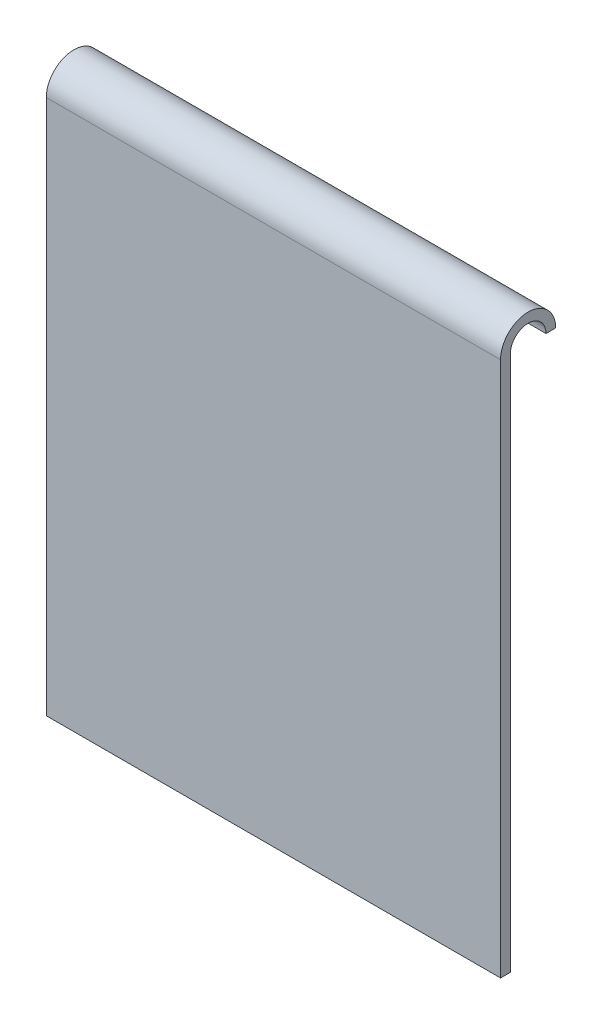
ISO-10303-21;
HEADER;
FILE_DESCRIPTION(('STEP AP214'),'2;1');
FILE_NAME('part.step','',(''),(''),'','','');
FILE_SCHEMA(('AUTOMOTIVE_DESIGN { 1 0 10303 214 1 1 1 1 }'));
ENDSEC;
DATA;
#1=APPLICATION_CONTEXT('core data for automotive mechanical design processes');
#2=APPLICATION_PROTOCOL_DEFINITION('international standard','automotive_design',2000,#1);
#3=PRODUCT_CONTEXT('',#1,'mechanical');
#4=PRODUCT('Part','Part','',(#3));
#5=PRODUCT_RELATED_PRODUCT_CATEGORY('part','',(#4));
#6=PRODUCT_DEFINITION_FORMATION('','',#4);
#7=PRODUCT_DEFINITION_CONTEXT('part definition',#1,'design');
#8=PRODUCT_DEFINITION('design','',#6,#7);
#9=PRODUCT_DEFINITION_SHAPE('','',#8);
#10=(LENGTH_UNIT() NAMED_UNIT(*) SI_UNIT(.MILLI.,.METRE.));
#11=(NAMED_UNIT(*) PLANE_ANGLE_UNIT() SI_UNIT($,.RADIAN.));
#12=(NAMED_UNIT(*) SI_UNIT($,.STERADIAN.) SOLID_ANGLE_UNIT());
#13=UNCERTAINTY_MEASURE_WITH_UNIT(LENGTH_MEASURE(1.E-05),#10,'distance_accuracy_value','');
#14=(GEOMETRIC_REPRESENTATION_CONTEXT(3) GLOBAL_UNCERTAINTY_ASSIGNED_CONTEXT((#13)) GLOBAL_UNIT_ASSIGNED_CONTEXT((#10,
#11,#12)) REPRESENTATION_CONTEXT('',''));
#15=CARTESIAN_POINT('',(0.,0.,0.));
#16=DIRECTION('',(0.,0.,1.));
#17=DIRECTION('',(1.,0.,0.));
#18=AXIS2_PLACEMENT_3D('',#15,#16,#17);
#19=CARTESIAN_POINT('',(-7.,-4.,1.7));
#20=DIRECTION('',(1.,0.,0.));
#21=DIRECTION('',(0.,0.,-1.));
#22=AXIS2_PLACEMENT_3D('',#19,#20,#21);
#23=CYLINDRICAL_SURFACE('',#22,0.85);
#24=DIRECTION('',(1.,0.,0.));
#25=VECTOR('',#24,1.);
#26=CARTESIAN_POINT('',(-7.,-4.,2.55));
#27=LINE('',#26,#25);
#28=CARTESIAN_POINT('',(-7.,-4.,2.55));
#29=VERTEX_POINT('',#28);
#30=CARTESIAN_POINT('',(7.,-4.,2.55));
#31=VERTEX_POINT('',#30);
#32=EDGE_CURVE('E42',#29,#31,#27,.T.);
#33=ORIENTED_EDGE('',*,*,#32,.T.);
#34=CARTESIAN_POINT('',(7.,-4.,1.7));
#35=DIRECTION('',(1.,0.,0.));
#36=DIRECTION('',(0.,0.,-1.));
#37=AXIS2_PLACEMENT_3D('',#34,#35,#36);
#38=CIRCLE('',#37,0.85);
#39=CARTESIAN_POINT('',(7.,-4.,0.85));
#40=VERTEX_POINT('',#39);
#41=EDGE_CURVE('E91',#40,#31,#38,.T.);
#42=ORIENTED_EDGE('',*,*,#41,.F.);
#43=DIRECTION('',(1.,0.,0.));
#44=VECTOR('',#43,1.);
#45=CARTESIAN_POINT('',(-7.,-4.,0.85));
#46=LINE('',#45,#44);
#47=CARTESIAN_POINT('',(-7.,-4.,0.85));
#48=VERTEX_POINT('',#47);
#49=EDGE_CURVE('E11',#48,#40,#46,.T.);
#50=ORIENTED_EDGE('',*,*,#49,.F.);
#51=CARTESIAN_POINT('',(-7.,-4.,1.7));
#52=DIRECTION('',(1.,0.,0.));
#53=DIRECTION('',(0.,0.,-1.));
#54=AXIS2_PLACEMENT_3D('',#51,#52,#53);
#55=CIRCLE('',#54,0.85);
#56=EDGE_CURVE('E92',#48,#29,#55,.T.);
#57=ORIENTED_EDGE('',*,*,#56,.T.);
#58=EDGE_LOOP('',(#33,#42,#50,#57));
#59=FACE_BOUND('',#58,.T.);
#60=ADVANCED_FACE('F39',(#59),#23,.T.);
#61=CARTESIAN_POINT('',(-7.,-4.,1.15));
#62=DIRECTION('',(0.,-1.,0.));
#63=DIRECTION('',(0.,0.,-1.));
#64=AXIS2_PLACEMENT_3D('',#61,#62,#63);
#65=PLANE('',#64);
#66=ORIENTED_EDGE('',*,*,#49,.T.);
#67=DIRECTION('',(0.,0.,-1.));
#68=VECTOR('',#67,1.);
#69=CARTESIAN_POINT('',(7.,-4.,1.15));
#70=LINE('',#69,#68);
#71=CARTESIAN_POINT('',(7.,-4.,1.15));
#72=VERTEX_POINT('',#71);
#73=EDGE_CURVE('E109',#72,#40,#70,.T.);
#74=ORIENTED_EDGE('',*,*,#73,.F.);
#75=DIRECTION('',(1.,0.,0.));
#76=VECTOR('',#75,1.);
#77=CARTESIAN_POINT('',(-7.,-4.,1.15));
#78=LINE('',#77,#76);
#79=CARTESIAN_POINT('',(-7.,-4.,1.15));
#80=VERTEX_POINT('',#79);
#81=EDGE_CURVE('E47',#80,#72,#78,.T.);
#82=ORIENTED_EDGE('',*,*,#81,.F.);
#83=DIRECTION('',(0.,0.,-1.));
#84=VECTOR('',#83,1.);
#85=CARTESIAN_POINT('',(-7.,-4.,1.15));
#86=LINE('',#85,#84);
#87=EDGE_CURVE('E97',#80,#48,#86,.T.);
#88=ORIENTED_EDGE('',*,*,#87,.T.);
#89=EDGE_LOOP('',(#66,#74,#82,#88));
#90=FACE_BOUND('',#89,.T.);
#91=ADVANCED_FACE('F149',(#90),#65,.T.);
#92=CARTESIAN_POINT('',(-7.,-4.,1.7));
#93=DIRECTION('',(1.,0.,0.));
#94=DIRECTION('',(0.,0.,-1.));
#95=AXIS2_PLACEMENT_3D('',#92,#93,#94);
#96=CYLINDRICAL_SURFACE('',#95,0.55);
#97=ORIENTED_EDGE('',*,*,#81,.T.);
#98=CARTESIAN_POINT('',(7.,-4.,1.7));
#99=DIRECTION('',(-1.,0.,0.));
#100=DIRECTION('',(0.,0.,1.));
#101=AXIS2_PLACEMENT_3D('',#98,#99,#100);
#102=CIRCLE('',#101,0.55);
#103=CARTESIAN_POINT('',(7.,-4.,2.25));
#104=VERTEX_POINT('',#103);
#105=EDGE_CURVE('E116',#104,#72,#102,.T.);
#106=ORIENTED_EDGE('',*,*,#105,.F.);
#107=DIRECTION('',(1.,0.,0.));
#108=VECTOR('',#107,1.);
#109=CARTESIAN_POINT('',(-7.,-4.,2.25));
#110=LINE('',#109,#108);
#111=CARTESIAN_POINT('',(-7.,-4.,2.25));
#112=VERTEX_POINT('',#111);
#113=EDGE_CURVE('E132',#112,#104,#110,.T.);
#114=ORIENTED_EDGE('',*,*,#113,.F.);
#115=CARTESIAN_POINT('',(-7.,-4.,1.7));
#116=DIRECTION('',(-1.,0.,0.));
#117=DIRECTION('',(0.,0.,1.));
#118=AXIS2_PLACEMENT_3D('',#115,#116,#117);
#119=CIRCLE('',#118,0.55);
#120=EDGE_CURVE('E128',#112,#80,#119,.T.);
#121=ORIENTED_EDGE('',*,*,#120,.T.);
#122=EDGE_LOOP('',(#97,#106,#114,#121));
#123=FACE_BOUND('',#122,.T.);
#124=ADVANCED_FACE('F145',(#123),#96,.F.);
#125=CARTESIAN_POINT('',(-7.,-20.5,2.25));
#126=DIRECTION('',(0.,0.,-1.));
#127=DIRECTION('',(-1.,0.,0.));
#128=AXIS2_PLACEMENT_3D('',#125,#126,#127);
#129=PLANE('',#128);
#130=ORIENTED_EDGE('',*,*,#113,.T.);
#131=DIRECTION('',(0.,1.,0.));
#132=VECTOR('',#131,1.);
#133=CARTESIAN_POINT('',(7.,-20.5,2.25));
#134=LINE('',#133,#132);
#135=CARTESIAN_POINT('',(7.,-20.5,2.25));
#136=VERTEX_POINT('',#135);
#137=EDGE_CURVE('E113',#136,#104,#134,.T.);
#138=ORIENTED_EDGE('',*,*,#137,.F.);
#139=DIRECTION('',(1.,0.,0.));
#140=VECTOR('',#139,1.);
#141=CARTESIAN_POINT('',(-7.,-20.5,2.25));
#142=LINE('',#141,#140);
#143=CARTESIAN_POINT('',(-7.,-20.5,2.25));
#144=VERTEX_POINT('',#143);
#145=EDGE_CURVE('E134',#144,#136,#142,.T.);
#146=ORIENTED_EDGE('',*,*,#145,.F.);
#147=DIRECTION('',(0.,1.,0.));
#148=VECTOR('',#147,1.);
#149=CARTESIAN_POINT('',(-7.,-20.5,2.25));
#150=LINE('',#149,#148);
#151=EDGE_CURVE('E125',#144,#112,#150,.T.);
#152=ORIENTED_EDGE('',*,*,#151,.T.);
#153=EDGE_LOOP('',(#130,#138,#146,#152));
#154=FACE_BOUND('',#153,.T.);
#155=ADVANCED_FACE('F142',(#154),#129,.T.);
#156=CARTESIAN_POINT('',(-7.,-20.5,2.55));
#157=DIRECTION('',(0.,-1.,0.));
#158=DIRECTION('',(0.,0.,-1.));
#159=AXIS2_PLACEMENT_3D('',#156,#157,#158);
#160=PLANE('',#159);
#161=ORIENTED_EDGE('',*,*,#145,.T.);
#162=DIRECTION('',(0.,0.,-1.));
#163=VECTOR('',#162,1.);
#164=CARTESIAN_POINT('',(7.,-20.5,2.55));
#165=LINE('',#164,#163);
#166=CARTESIAN_POINT('',(7.,-20.5,2.55));
#167=VERTEX_POINT('',#166);
#168=EDGE_CURVE('E104',#167,#136,#165,.T.);
#169=ORIENTED_EDGE('',*,*,#168,.F.);
#170=DIRECTION('',(1.,0.,0.));
#171=VECTOR('',#170,1.);
#172=CARTESIAN_POINT('',(-7.,-20.5,2.55));
#173=LINE('',#172,#171);
#174=CARTESIAN_POINT('',(-7.,-20.5,2.55));
#175=VERTEX_POINT('',#174);
#176=EDGE_CURVE('E96',#175,#167,#173,.T.);
#177=ORIENTED_EDGE('',*,*,#176,.F.);
#178=DIRECTION('',(0.,0.,-1.));
#179=VECTOR('',#178,1.);
#180=CARTESIAN_POINT('',(-7.,-20.5,2.55));
#181=LINE('',#180,#179);
#182=EDGE_CURVE('E122',#175,#144,#181,.T.);
#183=ORIENTED_EDGE('',*,*,#182,.T.);
#184=EDGE_LOOP('',(#161,#169,#177,#183));
#185=FACE_BOUND('',#184,.T.);
#186=ADVANCED_FACE('F136',(#185),#160,.T.);
#187=CARTESIAN_POINT('',(-7.,-4.,2.55));
#188=DIRECTION('',(0.,0.,1.));
#189=DIRECTION('',(1.,0.,0.));
#190=AXIS2_PLACEMENT_3D('',#187,#188,#189);
#191=PLANE('',#190);
#192=ORIENTED_EDGE('',*,*,#176,.T.);
#193=DIRECTION('',(0.,-1.,0.));
#194=VECTOR('',#193,1.);
#195=CARTESIAN_POINT('',(7.,-4.,2.55));
#196=LINE('',#195,#194);
#197=EDGE_CURVE('E99',#31,#167,#196,.T.);
#198=ORIENTED_EDGE('',*,*,#197,.F.);
#199=ORIENTED_EDGE('',*,*,#32,.F.);
#200=DIRECTION('',(0.,-1.,0.));
#201=VECTOR('',#200,1.);
#202=CARTESIAN_POINT('',(-7.,-4.,2.55));
#203=LINE('',#202,#201);
#204=EDGE_CURVE('E120',#29,#175,#203,.T.);
#205=ORIENTED_EDGE('',*,*,#204,.T.);
#206=EDGE_LOOP('',(#192,#198,#199,#205));
#207=FACE_BOUND('',#206,.T.);
#208=ADVANCED_FACE('F100',(#207),#191,.T.);
#209=CARTESIAN_POINT('',(-7.,-4.,1.7));
#210=DIRECTION('',(1.,0.,0.));
#211=DIRECTION('',(0.,0.,-1.));
#212=AXIS2_PLACEMENT_3D('',#209,#210,#211);
#213=PLANE('',#212);
#214=ORIENTED_EDGE('',*,*,#56,.F.);
#215=ORIENTED_EDGE('',*,*,#87,.F.);
#216=ORIENTED_EDGE('',*,*,#120,.F.);
#217=ORIENTED_EDGE('',*,*,#151,.F.);
#218=ORIENTED_EDGE('',*,*,#182,.F.);
#219=ORIENTED_EDGE('',*,*,#204,.F.);
#220=EDGE_LOOP('',(#214,#215,#216,#217,#218,#219));
#221=FACE_BOUND('',#220,.T.);
#222=ADVANCED_FACE('F148',(#221),#213,.F.);
#223=CARTESIAN_POINT('',(7.,-4.,1.7));
#224=DIRECTION('',(1.,0.,0.));
#225=DIRECTION('',(0.,0.,-1.));
#226=AXIS2_PLACEMENT_3D('',#223,#224,#225);
#227=PLANE('',#226);
#228=ORIENTED_EDGE('',*,*,#41,.T.);
#229=ORIENTED_EDGE('',*,*,#197,.T.);
#230=ORIENTED_EDGE('',*,*,#168,.T.);
#231=ORIENTED_EDGE('',*,*,#137,.T.);
#232=ORIENTED_EDGE('',*,*,#105,.T.);
#233=ORIENTED_EDGE('',*,*,#73,.T.);
#234=EDGE_LOOP('',(#228,#229,#230,#231,#232,#233));
#235=FACE_BOUND('',#234,.T.);
#236=ADVANCED_FACE('F107',(#235),#227,.T.);
#237=CLOSED_SHELL('',(#60,#91,#124,#155,#186,#208,#222,#236));
#238=MANIFOLD_SOLID_BREP('B2',#237);
#239=ADVANCED_BREP_SHAPE_REPRESENTATION('',(#18,#238),#14);
#240=SHAPE_DEFINITION_REPRESENTATION(#9,#239);
ENDSEC;
END-ISO-10303-21;
